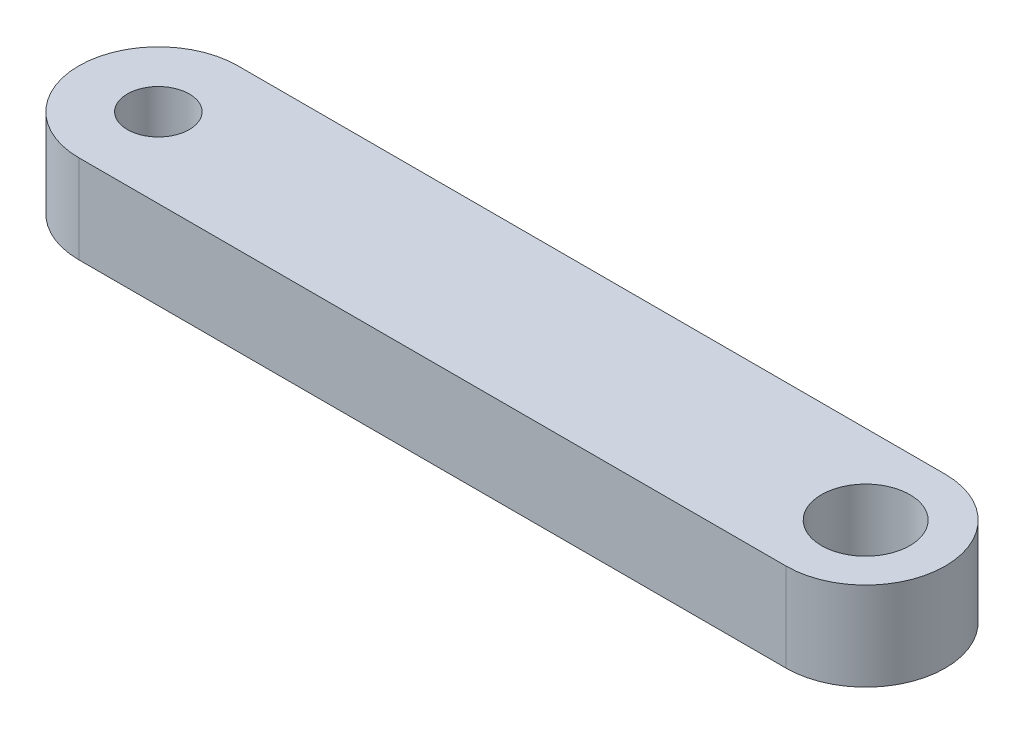
ISO-10303-21;
HEADER;
FILE_DESCRIPTION(('STEP AP214'),'2;1');
FILE_NAME('part.step','',(''),(''),'','','');
FILE_SCHEMA(('AUTOMOTIVE_DESIGN { 1 0 10303 214 1 1 1 1 }'));
ENDSEC;
DATA;
#1=APPLICATION_CONTEXT('core data for automotive mechanical design processes');
#2=APPLICATION_PROTOCOL_DEFINITION('international standard','automotive_design',2000,#1);
#3=PRODUCT_CONTEXT('',#1,'mechanical');
#4=PRODUCT('Part','Part','',(#3));
#5=PRODUCT_RELATED_PRODUCT_CATEGORY('part','',(#4));
#6=PRODUCT_DEFINITION_FORMATION('','',#4);
#7=PRODUCT_DEFINITION_CONTEXT('part definition',#1,'design');
#8=PRODUCT_DEFINITION('design','',#6,#7);
#9=PRODUCT_DEFINITION_SHAPE('','',#8);
#10=(LENGTH_UNIT() NAMED_UNIT(*) SI_UNIT(.MILLI.,.METRE.));
#11=(NAMED_UNIT(*) PLANE_ANGLE_UNIT() SI_UNIT($,.RADIAN.));
#12=(NAMED_UNIT(*) SI_UNIT($,.STERADIAN.) SOLID_ANGLE_UNIT());
#13=UNCERTAINTY_MEASURE_WITH_UNIT(LENGTH_MEASURE(1.E-05),#10,'distance_accuracy_value','');
#14=(GEOMETRIC_REPRESENTATION_CONTEXT(3) GLOBAL_UNCERTAINTY_ASSIGNED_CONTEXT((#13)) GLOBAL_UNIT_ASSIGNED_CONTEXT((#10,
#11,#12)) REPRESENTATION_CONTEXT('',''));
#15=CARTESIAN_POINT('',(0.,0.,0.));
#16=DIRECTION('',(0.,0.,1.));
#17=DIRECTION('',(1.,0.,0.));
#18=AXIS2_PLACEMENT_3D('',#15,#16,#17);
#19=CARTESIAN_POINT('',(0.,5.,0.));
#20=DIRECTION('',(0.,-1.,0.));
#21=DIRECTION('',(0.,0.,-1.));
#22=AXIS2_PLACEMENT_3D('',#19,#20,#21);
#23=CYLINDRICAL_SURFACE('',#22,4.5);
#24=CARTESIAN_POINT('',(0.,0.,0.));
#25=DIRECTION('',(0.,1.,0.));
#26=DIRECTION('',(0.,0.,1.));
#27=AXIS2_PLACEMENT_3D('',#24,#25,#26);
#28=CIRCLE('',#27,4.5);
#29=CARTESIAN_POINT('',(0.,0.,-4.5));
#30=VERTEX_POINT('',#29);
#31=CARTESIAN_POINT('',(0.,0.,4.5));
#32=VERTEX_POINT('',#31);
#33=EDGE_CURVE('E102',#30,#32,#28,.T.);
#34=ORIENTED_EDGE('',*,*,#33,.T.);
#35=DIRECTION('',(0.,-1.,0.));
#36=VECTOR('',#35,1.);
#37=CARTESIAN_POINT('',(0.,5.,4.5));
#38=LINE('',#37,#36);
#39=CARTESIAN_POINT('',(0.,5.,4.5));
#40=VERTEX_POINT('',#39);
#41=EDGE_CURVE('E11',#40,#32,#38,.T.);
#42=ORIENTED_EDGE('',*,*,#41,.F.);
#43=CARTESIAN_POINT('',(0.,5.,0.));
#44=DIRECTION('',(0.,1.,0.));
#45=DIRECTION('',(0.,0.,1.));
#46=AXIS2_PLACEMENT_3D('',#43,#44,#45);
#47=CIRCLE('',#46,4.5);
#48=CARTESIAN_POINT('',(0.,5.,-4.5));
#49=VERTEX_POINT('',#48);
#50=EDGE_CURVE('E89',#49,#40,#47,.T.);
#51=ORIENTED_EDGE('',*,*,#50,.F.);
#52=DIRECTION('',(0.,-1.,0.));
#53=VECTOR('',#52,1.);
#54=CARTESIAN_POINT('',(0.,5.,-4.5));
#55=LINE('',#54,#53);
#56=EDGE_CURVE('E98',#49,#30,#55,.T.);
#57=ORIENTED_EDGE('',*,*,#56,.T.);
#58=EDGE_LOOP('',(#34,#42,#51,#57));
#59=FACE_BOUND('',#58,.T.);
#60=ADVANCED_FACE('F37',(#59),#23,.T.);
#61=CARTESIAN_POINT('',(0.,5.,4.5));
#62=DIRECTION('',(0.,0.,-1.));
#63=DIRECTION('',(-1.,0.,0.));
#64=AXIS2_PLACEMENT_3D('',#61,#62,#63);
#65=PLANE('',#64);
#66=DIRECTION('',(1.,0.,0.));
#67=VECTOR('',#66,1.);
#68=CARTESIAN_POINT('',(0.,0.,4.5));
#69=LINE('',#68,#67);
#70=CARTESIAN_POINT('',(40.,0.,4.5));
#71=VERTEX_POINT('',#70);
#72=EDGE_CURVE('E93',#32,#71,#69,.T.);
#73=ORIENTED_EDGE('',*,*,#72,.T.);
#74=DIRECTION('',(0.,-1.,0.));
#75=VECTOR('',#74,1.);
#76=CARTESIAN_POINT('',(40.,5.,4.5));
#77=LINE('',#76,#75);
#78=CARTESIAN_POINT('',(40.,5.,4.5));
#79=VERTEX_POINT('',#78);
#80=EDGE_CURVE('E46',#79,#71,#77,.T.);
#81=ORIENTED_EDGE('',*,*,#80,.F.);
#82=DIRECTION('',(1.,0.,0.));
#83=VECTOR('',#82,1.);
#84=CARTESIAN_POINT('',(0.,5.,4.5));
#85=LINE('',#84,#83);
#86=EDGE_CURVE('E84',#40,#79,#85,.T.);
#87=ORIENTED_EDGE('',*,*,#86,.F.);
#88=ORIENTED_EDGE('',*,*,#41,.T.);
#89=EDGE_LOOP('',(#73,#81,#87,#88));
#90=FACE_BOUND('',#89,.T.);
#91=ADVANCED_FACE('F92',(#90),#65,.F.);
#92=CARTESIAN_POINT('',(40.,5.,0.));
#93=DIRECTION('',(0.,-1.,0.));
#94=DIRECTION('',(0.,0.,-1.));
#95=AXIS2_PLACEMENT_3D('',#92,#93,#94);
#96=CYLINDRICAL_SURFACE('',#95,4.5);
#97=CARTESIAN_POINT('',(40.,0.,0.));
#98=DIRECTION('',(0.,1.,0.));
#99=DIRECTION('',(0.,0.,1.));
#100=AXIS2_PLACEMENT_3D('',#97,#98,#99);
#101=CIRCLE('',#100,4.5);
#102=CARTESIAN_POINT('',(40.,0.,-4.5));
#103=VERTEX_POINT('',#102);
#104=EDGE_CURVE('E71',#71,#103,#101,.T.);
#105=ORIENTED_EDGE('',*,*,#104,.T.);
#106=DIRECTION('',(0.,-1.,0.));
#107=VECTOR('',#106,1.);
#108=CARTESIAN_POINT('',(40.,5.,-4.5));
#109=LINE('',#108,#107);
#110=CARTESIAN_POINT('',(40.,5.,-4.5));
#111=VERTEX_POINT('',#110);
#112=EDGE_CURVE('E94',#111,#103,#109,.T.);
#113=ORIENTED_EDGE('',*,*,#112,.F.);
#114=CARTESIAN_POINT('',(40.,5.,0.));
#115=DIRECTION('',(0.,1.,0.));
#116=DIRECTION('',(0.,0.,1.));
#117=AXIS2_PLACEMENT_3D('',#114,#115,#116);
#118=CIRCLE('',#117,4.5);
#119=EDGE_CURVE('E87',#79,#111,#118,.T.);
#120=ORIENTED_EDGE('',*,*,#119,.F.);
#121=ORIENTED_EDGE('',*,*,#80,.T.);
#122=EDGE_LOOP('',(#105,#113,#120,#121));
#123=FACE_BOUND('',#122,.T.);
#124=ADVANCED_FACE('F96',(#123),#96,.T.);
#125=CARTESIAN_POINT('',(0.,5.,-4.5));
#126=DIRECTION('',(0.,0.,1.));
#127=DIRECTION('',(1.,0.,0.));
#128=AXIS2_PLACEMENT_3D('',#125,#126,#127);
#129=PLANE('',#128);
#130=DIRECTION('',(-1.,0.,0.));
#131=VECTOR('',#130,1.);
#132=CARTESIAN_POINT('',(0.,0.,-4.5));
#133=LINE('',#132,#131);
#134=EDGE_CURVE('E77',#103,#30,#133,.T.);
#135=ORIENTED_EDGE('',*,*,#134,.T.);
#136=ORIENTED_EDGE('',*,*,#56,.F.);
#137=DIRECTION('',(-1.,0.,0.));
#138=VECTOR('',#137,1.);
#139=CARTESIAN_POINT('',(0.,5.,-4.5));
#140=LINE('',#139,#138);
#141=EDGE_CURVE('E54',#111,#49,#140,.T.);
#142=ORIENTED_EDGE('',*,*,#141,.F.);
#143=ORIENTED_EDGE('',*,*,#112,.T.);
#144=EDGE_LOOP('',(#135,#136,#142,#143));
#145=FACE_BOUND('',#144,.T.);
#146=ADVANCED_FACE('F110',(#145),#129,.F.);
#147=CARTESIAN_POINT('',(0.,5.,0.));
#148=DIRECTION('',(0.,1.,0.));
#149=DIRECTION('',(0.,0.,1.));
#150=AXIS2_PLACEMENT_3D('',#147,#148,#149);
#151=PLANE('',#150);
#152=CARTESIAN_POINT('',(40.,5.,0.));
#153=DIRECTION('',(0.,1.,0.));
#154=DIRECTION('',(0.,0.,1.));
#155=AXIS2_PLACEMENT_3D('',#152,#153,#154);
#156=CIRCLE('',#155,2.5);
#157=CARTESIAN_POINT('',(40.,5.,2.5));
#158=VERTEX_POINT('',#157);
#159=EDGE_CURVE('E121',#158,#158,#156,.T.);
#160=ORIENTED_EDGE('',*,*,#159,.F.);
#161=EDGE_LOOP('',(#160));
#162=FACE_BOUND('',#161,.T.);
#163=CARTESIAN_POINT('',(0.,5.,0.));
#164=DIRECTION('',(0.,1.,0.));
#165=DIRECTION('',(0.,0.,1.));
#166=AXIS2_PLACEMENT_3D('',#163,#164,#165);
#167=CIRCLE('',#166,1.75);
#168=CARTESIAN_POINT('',(0.,5.,1.75));
#169=VERTEX_POINT('',#168);
#170=EDGE_CURVE('E118',#169,#169,#167,.T.);
#171=ORIENTED_EDGE('',*,*,#170,.F.);
#172=EDGE_LOOP('',(#171));
#173=FACE_BOUND('',#172,.T.);
#174=ORIENTED_EDGE('',*,*,#50,.T.);
#175=ORIENTED_EDGE('',*,*,#86,.T.);
#176=ORIENTED_EDGE('',*,*,#119,.T.);
#177=ORIENTED_EDGE('',*,*,#141,.T.);
#178=EDGE_LOOP('',(#174,#175,#176,#177));
#179=FACE_BOUND('',#178,.T.);
#180=ADVANCED_FACE('F85',(#162,#173,#179),#151,.T.);
#181=CARTESIAN_POINT('',(0.,0.,0.));
#182=DIRECTION('',(0.,1.,0.));
#183=DIRECTION('',(0.,0.,1.));
#184=AXIS2_PLACEMENT_3D('',#181,#182,#183);
#185=PLANE('',#184);
#186=CARTESIAN_POINT('',(40.,0.,0.));
#187=DIRECTION('',(0.,1.,0.));
#188=DIRECTION('',(0.,0.,1.));
#189=AXIS2_PLACEMENT_3D('',#186,#187,#188);
#190=CIRCLE('',#189,2.5);
#191=CARTESIAN_POINT('',(40.,0.,2.5));
#192=VERTEX_POINT('',#191);
#193=EDGE_CURVE('E40',#192,#192,#190,.T.);
#194=ORIENTED_EDGE('',*,*,#193,.T.);
#195=EDGE_LOOP('',(#194));
#196=FACE_BOUND('',#195,.T.);
#197=CARTESIAN_POINT('',(0.,0.,0.));
#198=DIRECTION('',(0.,1.,0.));
#199=DIRECTION('',(0.,0.,1.));
#200=AXIS2_PLACEMENT_3D('',#197,#198,#199);
#201=CIRCLE('',#200,1.75);
#202=CARTESIAN_POINT('',(0.,0.,1.75));
#203=VERTEX_POINT('',#202);
#204=EDGE_CURVE('E105',#203,#203,#201,.F.);
#205=ORIENTED_EDGE('',*,*,#204,.F.);
#206=EDGE_LOOP('',(#205));
#207=FACE_BOUND('',#206,.T.);
#208=ORIENTED_EDGE('',*,*,#33,.F.);
#209=ORIENTED_EDGE('',*,*,#134,.F.);
#210=ORIENTED_EDGE('',*,*,#104,.F.);
#211=ORIENTED_EDGE('',*,*,#72,.F.);
#212=EDGE_LOOP('',(#208,#209,#210,#211));
#213=FACE_BOUND('',#212,.T.);
#214=ADVANCED_FACE('F113',(#196,#207,#213),#185,.F.);
#215=CARTESIAN_POINT('',(0.,-4.94974746830583,0.));
#216=DIRECTION('',(0.,1.,0.));
#217=DIRECTION('',(0.,0.,1.));
#218=AXIS2_PLACEMENT_3D('',#215,#216,#217);
#219=CYLINDRICAL_SURFACE('',#218,1.75);
#220=ORIENTED_EDGE('',*,*,#204,.T.);
#221=EDGE_LOOP('',(#220));
#222=FACE_BOUND('',#221,.T.);
#223=ORIENTED_EDGE('',*,*,#170,.T.);
#224=EDGE_LOOP('',(#223));
#225=FACE_BOUND('',#224,.T.);
#226=ADVANCED_FACE('F132',(#222,#225),#219,.F.);
#227=CARTESIAN_POINT('',(40.,-5.,0.));
#228=DIRECTION('',(0.,1.,0.));
#229=DIRECTION('',(0.,0.,1.));
#230=AXIS2_PLACEMENT_3D('',#227,#228,#229);
#231=CYLINDRICAL_SURFACE('',#230,2.5);
#232=ORIENTED_EDGE('',*,*,#159,.T.);
#233=EDGE_LOOP('',(#232));
#234=FACE_BOUND('',#233,.T.);
#235=ORIENTED_EDGE('',*,*,#193,.F.);
#236=EDGE_LOOP('',(#235));
#237=FACE_BOUND('',#236,.T.);
#238=ADVANCED_FACE('F130',(#234,#237),#231,.F.);
#239=CLOSED_SHELL('',(#60,#91,#124,#146,#180,#214,#226,#238));
#240=MANIFOLD_SOLID_BREP('B2',#239);
#241=ADVANCED_BREP_SHAPE_REPRESENTATION('',(#18,#240),#14);
#242=SHAPE_DEFINITION_REPRESENTATION(#9,#241);
ENDSEC;
END-ISO-10303-21;
